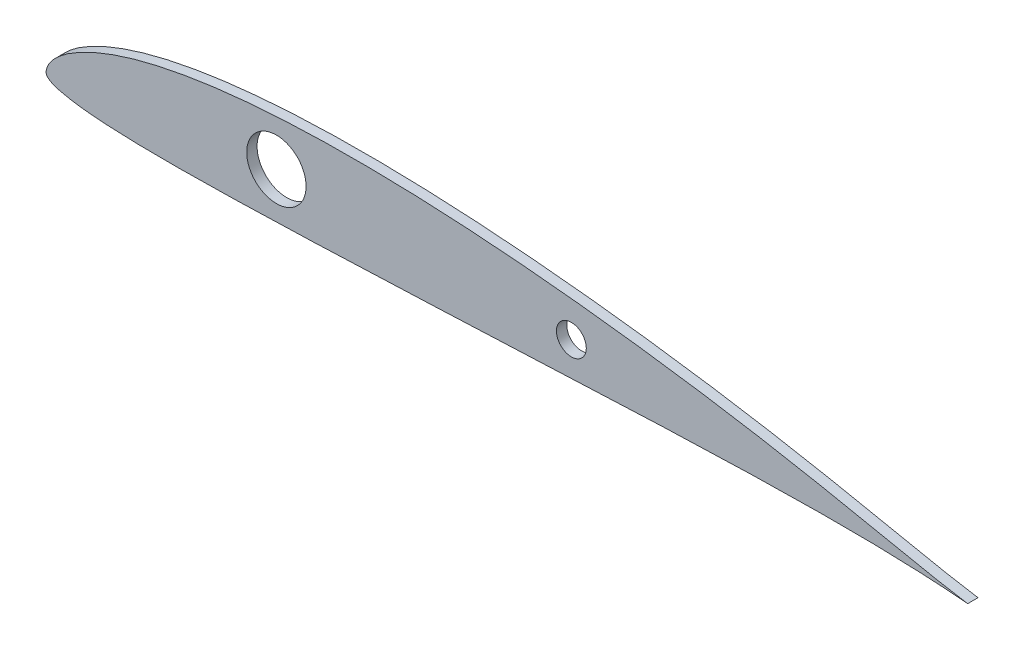
ISO-10303-21;
HEADER;
FILE_DESCRIPTION(('STEP AP214'),'2;1');
FILE_NAME('part.step','',(''),(''),'','','');
FILE_SCHEMA(('AUTOMOTIVE_DESIGN { 1 0 10303 214 1 1 1 1 }'));
ENDSEC;
DATA;
#1=APPLICATION_CONTEXT('core data for automotive mechanical design processes');
#2=APPLICATION_PROTOCOL_DEFINITION('international standard','automotive_design',2000,#1);
#3=PRODUCT_CONTEXT('',#1,'mechanical');
#4=PRODUCT('Part','Part','',(#3));
#5=PRODUCT_RELATED_PRODUCT_CATEGORY('part','',(#4));
#6=PRODUCT_DEFINITION_FORMATION('','',#4);
#7=PRODUCT_DEFINITION_CONTEXT('part definition',#1,'design');
#8=PRODUCT_DEFINITION('design','',#6,#7);
#9=PRODUCT_DEFINITION_SHAPE('','',#8);
#10=(LENGTH_UNIT() NAMED_UNIT(*) SI_UNIT(.MILLI.,.METRE.));
#11=(NAMED_UNIT(*) PLANE_ANGLE_UNIT() SI_UNIT($,.RADIAN.));
#12=(NAMED_UNIT(*) SI_UNIT($,.STERADIAN.) SOLID_ANGLE_UNIT());
#13=UNCERTAINTY_MEASURE_WITH_UNIT(LENGTH_MEASURE(1.E-05),#10,'distance_accuracy_value','');
#14=(GEOMETRIC_REPRESENTATION_CONTEXT(3) GLOBAL_UNCERTAINTY_ASSIGNED_CONTEXT((#13)) GLOBAL_UNIT_ASSIGNED_CONTEXT((#10,
#11,#12)) REPRESENTATION_CONTEXT('',''));
#15=CARTESIAN_POINT('',(0.,0.,0.));
#16=DIRECTION('',(0.,0.,1.));
#17=DIRECTION('',(1.,0.,0.));
#18=AXIS2_PLACEMENT_3D('',#15,#16,#17);
#19=CARTESIAN_POINT('',(122.909149152491,19.695001652524,1.4));
#20=DIRECTION('',(0.,0.,1.));
#21=DIRECTION('',(1.,0.,0.));
#22=AXIS2_PLACEMENT_3D('',#19,#20,#21);
#23=PLANE('',#22);
#24=CARTESIAN_POINT('',(62.5,8.27788529078682,1.4));
#25=DIRECTION('',(0.,0.,1.));
#26=DIRECTION('',(1.,0.,0.));
#27=AXIS2_PLACEMENT_3D('',#24,#25,#26);
#28=CIRCLE('',#27,8.04999999999998);
#29=CARTESIAN_POINT('',(70.55,8.27788529078682,1.4));
#30=VERTEX_POINT('',#29);
#31=EDGE_CURVE('E81',#30,#30,#28,.T.);
#32=ORIENTED_EDGE('',*,*,#31,.F.);
#33=EDGE_LOOP('',(#32));
#34=FACE_BOUND('',#33,.T.);
#35=CARTESIAN_POINT('',(250.,0.,1.4));
#36=CARTESIAN_POINT('',(249.728268943919,0.039573402998569,1.4));
#37=CARTESIAN_POINT('',(248.65287138319,0.196188335675669,1.4));
#38=CARTESIAN_POINT('',(246.279462903287,0.58717703685486,1.4));
#39=CARTESIAN_POINT('',(242.428352959134,1.28836080916575,1.4));
#40=CARTESIAN_POINT('',(237.222865340663,2.30938603771595,1.4));
#41=CARTESIAN_POINT('',(230.79382779892,3.62344421909736,1.4));
#42=CARTESIAN_POINT('',(223.269926583238,5.17187460876796,1.4));
#43=CARTESIAN_POINT('',(214.774490127352,6.89517256827551,1.4));
#44=CARTESIAN_POINT('',(205.421467640183,8.71476058066989,1.4));
#45=CARTESIAN_POINT('',(195.315832500534,10.5579589222704,1.4));
#46=CARTESIAN_POINT('',(184.55970612769,12.3678316594099,1.4));
#47=CARTESIAN_POINT('',(173.257486693249,14.0982758245334,1.4));
#48=CARTESIAN_POINT('',(161.523700661432,15.7182929831974,1.4));
#49=CARTESIAN_POINT('',(149.477836757131,17.1911408950679,1.4));
#50=CARTESIAN_POINT('',(137.244702140608,18.489945542155,1.4));
#51=CARTESIAN_POINT('',(124.948445656653,19.5769726993916,1.4));
#52=CARTESIAN_POINT('',(112.713330041099,20.423484935339,1.4));
#53=CARTESIAN_POINT('',(100.660093739076,21.0051416001249,1.4));
#54=CARTESIAN_POINT('',(88.9026364502243,21.2979438100715,1.4));
#55=CARTESIAN_POINT('',(77.5500099299321,21.2891641135575,1.4));
#56=CARTESIAN_POINT('',(66.7052142588153,20.964670684659,1.4));
#57=CARTESIAN_POINT('',(56.4628953881219,20.3205836143787,1.4));
#58=CARTESIAN_POINT('',(46.9045884992665,19.3559720315308,1.4));
#59=CARTESIAN_POINT('',(38.1026799163429,18.0641462264914,1.4));
#60=CARTESIAN_POINT('',(30.1162696194564,16.5024505604295,1.4));
#61=CARTESIAN_POINT('',(22.9978775177836,14.677376207673,1.4));
#62=CARTESIAN_POINT('',(16.7956132565994,12.6104581568868,1.4));
#63=CARTESIAN_POINT('',(11.5275673982234,10.3909231547578,1.4));
#64=CARTESIAN_POINT('',(7.22733529124609,8.0851664181968,1.4));
#65=CARTESIAN_POINT('',(3.89995090544149,5.7710780508246,1.4));
#66=CARTESIAN_POINT('',(1.60106590771376,3.50387039481658,1.4));
#67=CARTESIAN_POINT('',(0.335220364604832,1.55623386118943,1.4));
#68=CARTESIAN_POINT('',(0.0815034649712087,0.378373348952062,1.4));
#69=CARTESIAN_POINT('',(0.,0.,1.4));
#70=B_SPLINE_CURVE_WITH_KNOTS('',3,(#35,#36,#37,#38,#39,#40,#41,#42,#43,#44,#45,#46,#47,#48,#49,
#50,#51,#52,#53,#54,#55,#56,#57,#58,#59,#60,#61,#62,#63,#64,#65,#66,#67,#68,#69),.UNSPECIFIED.,
.F.,.F.,(4,1,1,1,1,1,1,1,1,1,1,1,1,1,1,1,1,1,1,1,1,1,1,1,1,1,1,1,1,1,1,1,4),(0.,
0.00320029505946198,0.0126654256977248,0.0280315288741438,0.0488197867099015,0.0744877461221257,
0.104508208723863,0.138345413769902,0.175514499798218,0.215555463632292,0.258061969819385,
0.302630362627261,0.348808108289403,0.396106185598487,0.444059495879598,0.492174763697098,
0.539964556046545,0.586986035233603,0.632802121000394,0.677021563817935,0.719279721870472,
0.759229812740591,0.796603314297569,0.83121054044555,0.86287445279422,0.891403649859957,
0.91679375160538,0.939002544961127,0.957938567970883,0.973592365563895,0.986016262710087,
0.995507894649427,1.),.UNSPECIFIED.);
#71=CARTESIAN_POINT('',(250.,0.,1.4));
#72=VERTEX_POINT('',#71);
#73=CARTESIAN_POINT('',(0.,0.,1.4));
#74=VERTEX_POINT('',#73);
#75=EDGE_CURVE('E73',#72,#74,#70,.T.);
#76=ORIENTED_EDGE('',*,*,#75,.T.);
#77=CARTESIAN_POINT('',(0.,0.,1.4));
#78=CARTESIAN_POINT('',(0.0188717182739675,-0.19145865445971,1.4));
#79=CARTESIAN_POINT('',(0.0950891688690186,-0.96470517740126,1.4));
#80=CARTESIAN_POINT('',(1.70615290210207,-2.10702766458785,1.4));
#81=CARTESIAN_POINT('',(4.5000874771452,-2.85176906675408,1.4));
#82=CARTESIAN_POINT('',(8.6874599416022,-3.64406199479493,1.4));
#83=CARTESIAN_POINT('',(14.1356575031106,-4.15912966959806,1.4));
#84=CARTESIAN_POINT('',(20.8481120121066,-4.52354984565553,1.4));
#85=CARTESIAN_POINT('',(28.7529077923904,-4.68851412634225,1.4));
#86=CARTESIAN_POINT('',(37.7797956093181,-4.68904195448849,1.4));
#87=CARTESIAN_POINT('',(47.837831161016,-4.53803950293088,1.4));
#88=CARTESIAN_POINT('',(58.8203063740162,-4.2519215875684,1.4));
#89=CARTESIAN_POINT('',(70.6067925099276,-3.86860802540783,1.4));
#90=CARTESIAN_POINT('',(83.0601015301456,-3.40903377813743,1.4));
#91=CARTESIAN_POINT('',(96.0356357008642,-2.87934625062155,1.4));
#92=CARTESIAN_POINT('',(109.387239836728,-2.30638338819967,1.4));
#93=CARTESIAN_POINT('',(122.965978931337,-1.69486033340608,1.4));
#94=CARTESIAN_POINT('',(136.622137742968,-1.07363908920158,1.4));
#95=CARTESIAN_POINT('',(150.199115392042,-0.470922150698433,1.4));
#96=CARTESIAN_POINT('',(163.536582950256,0.076551628042982,1.4));
#97=CARTESIAN_POINT('',(176.471135171749,0.56679818816534,1.4));
#98=CARTESIAN_POINT('',(188.841099971825,0.957639352744343,1.4));
#99=CARTESIAN_POINT('',(200.483907745942,1.22814305874205,1.4));
#100=CARTESIAN_POINT('',(211.234601880632,1.3581890105903,1.4));
#101=CARTESIAN_POINT('',(220.926690721326,1.34769777457219,1.4));
#102=CARTESIAN_POINT('',(229.39612438014,1.180923212118,1.4));
#103=CARTESIAN_POINT('',(236.496758910014,0.917479417512683,1.4));
#104=CARTESIAN_POINT('',(242.114506531552,0.607102556297051,1.4));
#105=CARTESIAN_POINT('',(246.175281813237,0.333070259552685,1.4));
#106=CARTESIAN_POINT('',(248.628885904779,0.125433468820893,1.4));
#107=CARTESIAN_POINT('',(249.72501449134,0.0251564668082476,1.4));
#108=CARTESIAN_POINT('',(250.,0.,1.4));
#109=B_SPLINE_CURVE_WITH_KNOTS('',3,(#77,#78,#79,#80,#81,#82,#83,#84,#85,#86,#87,#88,#89,#90,
#91,#92,#93,#94,#95,#96,#97,#98,#99,#100,#101,#102,#103,#104,#105,#106,#107,#108),.UNSPECIFIED.,
.F.,.F.,(4,1,1,1,1,1,1,1,1,1,1,1,1,1,1,1,1,1,1,1,1,1,1,1,1,1,1,1,1,4),(0.,0.00224968223149498,
0.00908582047719841,0.0208421058939337,0.0376354769504085,0.0594674660490852,0.0862520112256425,
0.117796131608622,0.15382656505708,0.19396821355772,0.237839144964153,0.284932657831076,
0.334700790583997,0.386556231287827,0.439909986978404,0.494183893738622,0.548767569040233,
0.603049647111274,0.656369422233639,0.708069226818465,0.757519447103187,0.804063607503982,
0.847048372990811,0.88582366984191,0.919722659900924,0.948135677752161,0.970615183250923,
0.986864288375966,0.99670464725869,1.),.UNSPECIFIED.);
#110=EDGE_CURVE('E57',#74,#72,#109,.T.);
#111=ORIENTED_EDGE('',*,*,#110,.T.);
#112=EDGE_LOOP('',(#76,#111));
#113=FACE_BOUND('',#112,.T.);
#114=CARTESIAN_POINT('',(142.5,8.27788529078682,1.4));
#115=DIRECTION('',(0.,0.,1.));
#116=DIRECTION('',(1.,0.,0.));
#117=AXIS2_PLACEMENT_3D('',#114,#115,#116);
#118=CIRCLE('',#117,4.04999999999999);
#119=CARTESIAN_POINT('',(146.55,8.27788529078682,1.4));
#120=VERTEX_POINT('',#119);
#121=EDGE_CURVE('E128',#120,#120,#118,.T.);
#122=ORIENTED_EDGE('',*,*,#121,.F.);
#123=EDGE_LOOP('',(#122));
#124=FACE_BOUND('',#123,.T.);
#125=ADVANCED_FACE('F39',(#34,#113,#124),#23,.T.);
#126=CARTESIAN_POINT('',(122.909149152491,19.695001652524,-1.4));
#127=DIRECTION('',(0.,0.,1.));
#128=DIRECTION('',(1.,0.,0.));
#129=AXIS2_PLACEMENT_3D('',#126,#127,#128);
#130=PLANE('',#129);
#131=CARTESIAN_POINT('',(250.,0.,-1.4));
#132=CARTESIAN_POINT('',(249.728268943919,0.039573402998569,-1.4));
#133=CARTESIAN_POINT('',(248.65287138319,0.196188335675669,-1.4));
#134=CARTESIAN_POINT('',(246.279462903287,0.58717703685486,-1.4));
#135=CARTESIAN_POINT('',(242.428352959134,1.28836080916575,-1.4));
#136=CARTESIAN_POINT('',(237.222865340663,2.30938603771595,-1.4));
#137=CARTESIAN_POINT('',(230.79382779892,3.62344421909736,-1.4));
#138=CARTESIAN_POINT('',(223.269926583238,5.17187460876796,-1.4));
#139=CARTESIAN_POINT('',(214.774490127352,6.89517256827551,-1.4));
#140=CARTESIAN_POINT('',(205.421467640183,8.71476058066989,-1.4));
#141=CARTESIAN_POINT('',(195.315832500534,10.5579589222704,-1.4));
#142=CARTESIAN_POINT('',(184.55970612769,12.3678316594099,-1.4));
#143=CARTESIAN_POINT('',(173.257486693249,14.0982758245334,-1.4));
#144=CARTESIAN_POINT('',(161.523700661432,15.7182929831974,-1.4));
#145=CARTESIAN_POINT('',(149.477836757131,17.1911408950679,-1.4));
#146=CARTESIAN_POINT('',(137.244702140608,18.489945542155,-1.4));
#147=CARTESIAN_POINT('',(124.948445656653,19.5769726993916,-1.4));
#148=CARTESIAN_POINT('',(112.713330041099,20.423484935339,-1.4));
#149=CARTESIAN_POINT('',(100.660093739076,21.0051416001249,-1.4));
#150=CARTESIAN_POINT('',(88.9026364502243,21.2979438100715,-1.4));
#151=CARTESIAN_POINT('',(77.5500099299321,21.2891641135575,-1.4));
#152=CARTESIAN_POINT('',(66.7052142588153,20.964670684659,-1.4));
#153=CARTESIAN_POINT('',(56.4628953881219,20.3205836143787,-1.4));
#154=CARTESIAN_POINT('',(46.9045884992665,19.3559720315308,-1.4));
#155=CARTESIAN_POINT('',(38.1026799163429,18.0641462264914,-1.4));
#156=CARTESIAN_POINT('',(30.1162696194564,16.5024505604295,-1.4));
#157=CARTESIAN_POINT('',(22.9978775177836,14.677376207673,-1.4));
#158=CARTESIAN_POINT('',(16.7956132565994,12.6104581568868,-1.4));
#159=CARTESIAN_POINT('',(11.5275673982234,10.3909231547578,-1.4));
#160=CARTESIAN_POINT('',(7.22733529124609,8.0851664181968,-1.4));
#161=CARTESIAN_POINT('',(3.89995090544149,5.7710780508246,-1.4));
#162=CARTESIAN_POINT('',(1.60106590771376,3.50387039481658,-1.4));
#163=CARTESIAN_POINT('',(0.335220364604832,1.55623386118943,-1.4));
#164=CARTESIAN_POINT('',(0.0815034649712087,0.378373348952062,-1.4));
#165=CARTESIAN_POINT('',(0.,0.,-1.4));
#166=B_SPLINE_CURVE_WITH_KNOTS('',3,(#131,#132,#133,#134,#135,#136,#137,#138,#139,#140,#141,
#142,#143,#144,#145,#146,#147,#148,#149,#150,#151,#152,#153,#154,#155,#156,#157,#158,#159,#160,
#161,#162,#163,#164,#165),.UNSPECIFIED.,.F.,.F.,(4,1,1,1,1,1,1,1,1,1,1,1,1,1,1,1,1,1,1,1,1,1,1,
1,1,1,1,1,1,1,1,1,4),(0.,0.00320029505946198,0.0126654256977248,0.0280315288741438,
0.0488197867099015,0.0744877461221257,0.104508208723863,0.138345413769902,0.175514499798218,
0.215555463632292,0.258061969819385,0.302630362627261,0.348808108289403,0.396106185598487,
0.444059495879598,0.492174763697098,0.539964556046545,0.586986035233603,0.632802121000394,
0.677021563817935,0.719279721870472,0.759229812740591,0.796603314297569,0.83121054044555,
0.86287445279422,0.891403649859957,0.91679375160538,0.939002544961127,0.957938567970883,
0.973592365563895,0.986016262710087,0.995507894649427,1.),.UNSPECIFIED.);
#167=CARTESIAN_POINT('',(250.,0.,-1.4));
#168=VERTEX_POINT('',#167);
#169=CARTESIAN_POINT('',(0.,0.,-1.4));
#170=VERTEX_POINT('',#169);
#171=EDGE_CURVE('E74',#168,#170,#166,.T.);
#172=ORIENTED_EDGE('',*,*,#171,.F.);
#173=CARTESIAN_POINT('',(0.,0.,-1.4));
#174=CARTESIAN_POINT('',(0.0188717182739675,-0.19145865445971,-1.4));
#175=CARTESIAN_POINT('',(0.0950891688690186,-0.96470517740126,-1.4));
#176=CARTESIAN_POINT('',(1.70615290210207,-2.10702766458785,-1.4));
#177=CARTESIAN_POINT('',(4.5000874771452,-2.85176906675408,-1.4));
#178=CARTESIAN_POINT('',(8.6874599416022,-3.64406199479493,-1.4));
#179=CARTESIAN_POINT('',(14.1356575031106,-4.15912966959806,-1.4));
#180=CARTESIAN_POINT('',(20.8481120121066,-4.52354984565553,-1.4));
#181=CARTESIAN_POINT('',(28.7529077923904,-4.68851412634225,-1.4));
#182=CARTESIAN_POINT('',(37.7797956093181,-4.68904195448849,-1.4));
#183=CARTESIAN_POINT('',(47.837831161016,-4.53803950293088,-1.4));
#184=CARTESIAN_POINT('',(58.8203063740162,-4.2519215875684,-1.4));
#185=CARTESIAN_POINT('',(70.6067925099276,-3.86860802540783,-1.4));
#186=CARTESIAN_POINT('',(83.0601015301456,-3.40903377813743,-1.4));
#187=CARTESIAN_POINT('',(96.0356357008642,-2.87934625062155,-1.4));
#188=CARTESIAN_POINT('',(109.387239836728,-2.30638338819967,-1.4));
#189=CARTESIAN_POINT('',(122.965978931337,-1.69486033340608,-1.4));
#190=CARTESIAN_POINT('',(136.622137742968,-1.07363908920158,-1.4));
#191=CARTESIAN_POINT('',(150.199115392042,-0.470922150698433,-1.4));
#192=CARTESIAN_POINT('',(163.536582950256,0.076551628042982,-1.4));
#193=CARTESIAN_POINT('',(176.471135171749,0.56679818816534,-1.4));
#194=CARTESIAN_POINT('',(188.841099971825,0.957639352744343,-1.4));
#195=CARTESIAN_POINT('',(200.483907745942,1.22814305874205,-1.4));
#196=CARTESIAN_POINT('',(211.234601880632,1.3581890105903,-1.4));
#197=CARTESIAN_POINT('',(220.926690721326,1.34769777457219,-1.4));
#198=CARTESIAN_POINT('',(229.39612438014,1.180923212118,-1.4));
#199=CARTESIAN_POINT('',(236.496758910014,0.917479417512683,-1.4));
#200=CARTESIAN_POINT('',(242.114506531552,0.607102556297051,-1.4));
#201=CARTESIAN_POINT('',(246.175281813237,0.333070259552685,-1.4));
#202=CARTESIAN_POINT('',(248.628885904779,0.125433468820893,-1.4));
#203=CARTESIAN_POINT('',(249.72501449134,0.0251564668082476,-1.4));
#204=CARTESIAN_POINT('',(250.,0.,-1.4));
#205=B_SPLINE_CURVE_WITH_KNOTS('',3,(#173,#174,#175,#176,#177,#178,#179,#180,#181,#182,#183,
#184,#185,#186,#187,#188,#189,#190,#191,#192,#193,#194,#195,#196,#197,#198,#199,#200,#201,#202,
#203,#204),.UNSPECIFIED.,.F.,.F.,(4,1,1,1,1,1,1,1,1,1,1,1,1,1,1,1,1,1,1,1,1,1,1,1,1,1,1,1,1,4),
(0.,0.00224968223149498,0.00908582047719841,0.0208421058939337,0.0376354769504085,
0.0594674660490852,0.0862520112256425,0.117796131608622,0.15382656505708,0.19396821355772,
0.237839144964153,0.284932657831076,0.334700790583997,0.386556231287827,0.439909986978404,
0.494183893738622,0.548767569040233,0.603049647111274,0.656369422233639,0.708069226818465,
0.757519447103187,0.804063607503982,0.847048372990811,0.88582366984191,0.919722659900924,
0.948135677752161,0.970615183250923,0.986864288375966,0.99670464725869,1.),.UNSPECIFIED.);
#206=EDGE_CURVE('E65',#170,#168,#205,.T.);
#207=ORIENTED_EDGE('',*,*,#206,.F.);
#208=EDGE_LOOP('',(#172,#207));
#209=FACE_BOUND('',#208,.T.);
#210=CARTESIAN_POINT('',(62.5,8.27788529078682,-1.4));
#211=DIRECTION('',(0.,0.,1.));
#212=DIRECTION('',(1.,0.,0.));
#213=AXIS2_PLACEMENT_3D('',#210,#211,#212);
#214=CIRCLE('',#213,8.04999999999998);
#215=CARTESIAN_POINT('',(70.55,8.27788529078682,-1.4));
#216=VERTEX_POINT('',#215);
#217=EDGE_CURVE('E85',#216,#216,#214,.T.);
#218=ORIENTED_EDGE('',*,*,#217,.T.);
#219=EDGE_LOOP('',(#218));
#220=FACE_BOUND('',#219,.T.);
#221=CARTESIAN_POINT('',(142.5,8.27788529078682,-1.4));
#222=DIRECTION('',(0.,0.,1.));
#223=DIRECTION('',(1.,0.,0.));
#224=AXIS2_PLACEMENT_3D('',#221,#222,#223);
#225=CIRCLE('',#224,4.04999999999999);
#226=CARTESIAN_POINT('',(146.55,8.27788529078682,-1.4));
#227=VERTEX_POINT('',#226);
#228=EDGE_CURVE('E131',#227,#227,#225,.T.);
#229=ORIENTED_EDGE('',*,*,#228,.T.);
#230=EDGE_LOOP('',(#229));
#231=FACE_BOUND('',#230,.T.);
#232=ADVANCED_FACE('F78',(#209,#220,#231),#130,.F.);
#233=DIRECTION('',(0.,0.,-1.));
#234=VECTOR('',#233,1.);
#235=SURFACE_OF_LINEAR_EXTRUSION('',#70,#234);
#236=ORIENTED_EDGE('',*,*,#171,.T.);
#237=DIRECTION('',(0.,0.,-1.));
#238=VECTOR('',#237,1.);
#239=CARTESIAN_POINT('',(0.,0.,1.4));
#240=LINE('',#239,#238);
#241=EDGE_CURVE('E11',#74,#170,#240,.T.);
#242=ORIENTED_EDGE('',*,*,#241,.F.);
#243=ORIENTED_EDGE('',*,*,#75,.F.);
#244=DIRECTION('',(0.,0.,-1.));
#245=VECTOR('',#244,1.);
#246=CARTESIAN_POINT('',(250.,0.,1.4));
#247=LINE('',#246,#245);
#248=EDGE_CURVE('E50',#72,#168,#247,.T.);
#249=ORIENTED_EDGE('',*,*,#248,.T.);
#250=EDGE_LOOP('',(#236,#242,#243,#249));
#251=FACE_BOUND('',#250,.T.);
#252=ADVANCED_FACE('F41',(#251),#235,.F.);
#253=DIRECTION('',(0.,0.,-1.));
#254=VECTOR('',#253,1.);
#255=SURFACE_OF_LINEAR_EXTRUSION('',#109,#254);
#256=ORIENTED_EDGE('',*,*,#206,.T.);
#257=ORIENTED_EDGE('',*,*,#248,.F.);
#258=ORIENTED_EDGE('',*,*,#110,.F.);
#259=ORIENTED_EDGE('',*,*,#241,.T.);
#260=EDGE_LOOP('',(#256,#257,#258,#259));
#261=FACE_BOUND('',#260,.T.);
#262=ADVANCED_FACE('F68',(#261),#255,.F.);
#263=CARTESIAN_POINT('',(62.5,8.27788529078682,1.4));
#264=DIRECTION('',(0.,0.,-1.));
#265=DIRECTION('',(-1.,0.,0.));
#266=AXIS2_PLACEMENT_3D('',#263,#264,#265);
#267=CYLINDRICAL_SURFACE('',#266,8.04999999999998);
#268=ORIENTED_EDGE('',*,*,#31,.T.);
#269=EDGE_LOOP('',(#268));
#270=FACE_BOUND('',#269,.T.);
#271=ORIENTED_EDGE('',*,*,#217,.F.);
#272=EDGE_LOOP('',(#271));
#273=FACE_BOUND('',#272,.T.);
#274=ADVANCED_FACE('F111',(#270,#273),#267,.F.);
#275=CARTESIAN_POINT('',(142.5,8.27788529078682,1.4));
#276=DIRECTION('',(0.,0.,-1.));
#277=DIRECTION('',(-1.,0.,0.));
#278=AXIS2_PLACEMENT_3D('',#275,#276,#277);
#279=CYLINDRICAL_SURFACE('',#278,4.04999999999999);
#280=ORIENTED_EDGE('',*,*,#121,.T.);
#281=EDGE_LOOP('',(#280));
#282=FACE_BOUND('',#281,.T.);
#283=ORIENTED_EDGE('',*,*,#228,.F.);
#284=EDGE_LOOP('',(#283));
#285=FACE_BOUND('',#284,.T.);
#286=ADVANCED_FACE('F119',(#282,#285),#279,.F.);
#287=CLOSED_SHELL('',(#125,#232,#252,#262,#274,#286));
#288=MANIFOLD_SOLID_BREP('B2',#287);
#289=ADVANCED_BREP_SHAPE_REPRESENTATION('',(#18,#288),#14);
#290=SHAPE_DEFINITION_REPRESENTATION(#9,#289);
ENDSEC;
END-ISO-10303-21;
